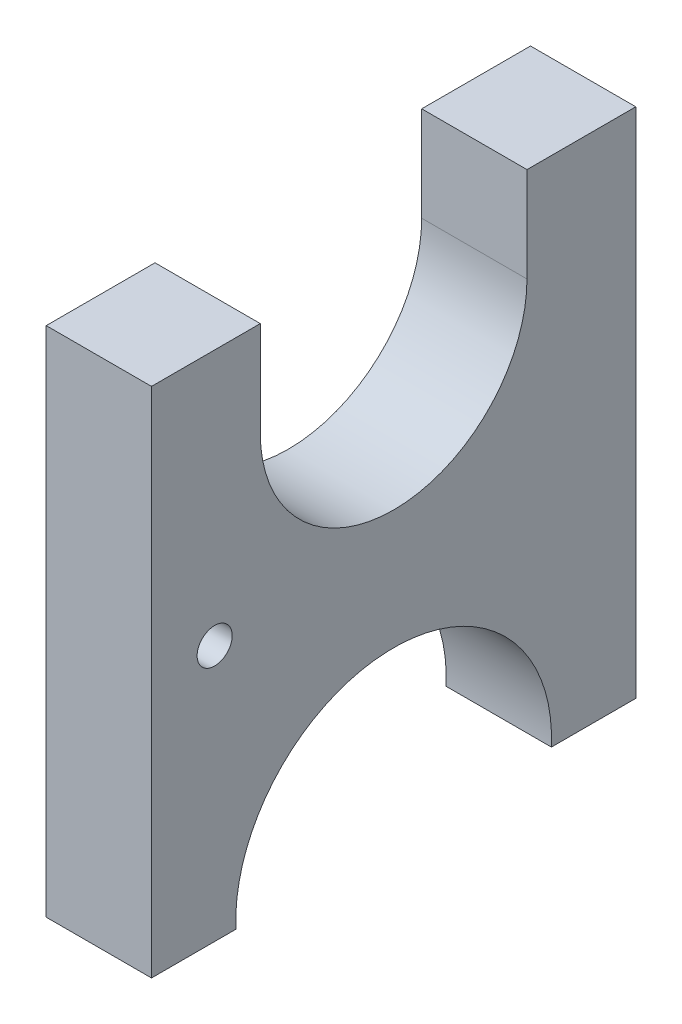
ISO-10303-21;
HEADER;
FILE_DESCRIPTION(('STEP AP214'),'2;1');
FILE_NAME('part.step','',(''),(''),'','','');
FILE_SCHEMA(('AUTOMOTIVE_DESIGN { 1 0 10303 214 1 1 1 1 }'));
ENDSEC;
DATA;
#1=APPLICATION_CONTEXT('core data for automotive mechanical design processes');
#2=APPLICATION_PROTOCOL_DEFINITION('international standard','automotive_design',2000,#1);
#3=PRODUCT_CONTEXT('',#1,'mechanical');
#4=PRODUCT('Part','Part','',(#3));
#5=PRODUCT_RELATED_PRODUCT_CATEGORY('part','',(#4));
#6=PRODUCT_DEFINITION_FORMATION('','',#4);
#7=PRODUCT_DEFINITION_CONTEXT('part definition',#1,'design');
#8=PRODUCT_DEFINITION('design','',#6,#7);
#9=PRODUCT_DEFINITION_SHAPE('','',#8);
#10=(LENGTH_UNIT() NAMED_UNIT(*) SI_UNIT(.MILLI.,.METRE.));
#11=(NAMED_UNIT(*) PLANE_ANGLE_UNIT() SI_UNIT($,.RADIAN.));
#12=(NAMED_UNIT(*) SI_UNIT($,.STERADIAN.) SOLID_ANGLE_UNIT());
#13=UNCERTAINTY_MEASURE_WITH_UNIT(LENGTH_MEASURE(1.E-05),#10,'distance_accuracy_value','');
#14=(GEOMETRIC_REPRESENTATION_CONTEXT(3) GLOBAL_UNCERTAINTY_ASSIGNED_CONTEXT((#13)) GLOBAL_UNIT_ASSIGNED_CONTEXT((#10,
#11,#12)) REPRESENTATION_CONTEXT('',''));
#15=CARTESIAN_POINT('',(0.,0.,0.));
#16=DIRECTION('',(0.,0.,1.));
#17=DIRECTION('',(1.,0.,0.));
#18=AXIS2_PLACEMENT_3D('',#15,#16,#17);
#19=CARTESIAN_POINT('',(-3.,-12.5,19.));
#20=DIRECTION('',(0.,0.,-1.));
#21=DIRECTION('',(0.,1.,0.));
#22=AXIS2_PLACEMENT_3D('',#19,#20,#21);
#23=PLANE('',#22);
#24=DIRECTION('',(0.,1.,0.));
#25=VECTOR('',#24,1.);
#26=CARTESIAN_POINT('',(12.,-12.5,19.));
#27=LINE('',#26,#25);
#28=CARTESIAN_POINT('',(12.,-12.5,19.));
#29=VERTEX_POINT('',#28);
#30=CARTESIAN_POINT('',(12.,1.,19.));
#31=VERTEX_POINT('',#30);
#32=EDGE_CURVE('E158',#29,#31,#27,.T.);
#33=ORIENTED_EDGE('',*,*,#32,.F.);
#34=DIRECTION('',(1.,0.,0.));
#35=VECTOR('',#34,1.);
#36=CARTESIAN_POINT('',(-3.,-12.5,19.));
#37=LINE('',#36,#35);
#38=CARTESIAN_POINT('',(-3.,-12.5,19.));
#39=VERTEX_POINT('',#38);
#40=EDGE_CURVE('E56',#39,#29,#37,.T.);
#41=ORIENTED_EDGE('',*,*,#40,.F.);
#42=DIRECTION('',(0.,1.,0.));
#43=VECTOR('',#42,1.);
#44=CARTESIAN_POINT('',(-3.,-12.5,19.));
#45=LINE('',#44,#43);
#46=CARTESIAN_POINT('',(-3.,1.,19.));
#47=VERTEX_POINT('',#46);
#48=EDGE_CURVE('E186',#39,#47,#45,.T.);
#49=ORIENTED_EDGE('',*,*,#48,.T.);
#50=DIRECTION('',(1.,0.,0.));
#51=VECTOR('',#50,1.);
#52=CARTESIAN_POINT('',(-3.,1.,19.));
#53=LINE('',#52,#51);
#54=EDGE_CURVE('E110',#47,#31,#53,.T.);
#55=ORIENTED_EDGE('',*,*,#54,.T.);
#56=EDGE_LOOP('',(#33,#41,#49,#55));
#57=FACE_BOUND('',#56,.T.);
#58=ADVANCED_FACE('F47',(#57),#23,.T.);
#59=CARTESIAN_POINT('',(-3.,-12.5,0.));
#60=DIRECTION('',(1.,0.,0.));
#61=DIRECTION('',(0.,0.,-1.));
#62=AXIS2_PLACEMENT_3D('',#59,#60,#61);
#63=CYLINDRICAL_SURFACE('',#62,19.);
#64=CARTESIAN_POINT('',(12.,-12.5,0.));
#65=DIRECTION('',(-1.,0.,0.));
#66=DIRECTION('',(0.,0.,-1.));
#67=AXIS2_PLACEMENT_3D('',#64,#65,#66);
#68=CIRCLE('',#67,19.);
#69=CARTESIAN_POINT('',(12.,-12.5,-19.));
#70=VERTEX_POINT('',#69);
#71=EDGE_CURVE('E183',#70,#29,#68,.T.);
#72=ORIENTED_EDGE('',*,*,#71,.F.);
#73=DIRECTION('',(1.,0.,0.));
#74=VECTOR('',#73,1.);
#75=CARTESIAN_POINT('',(-3.,-12.5,-19.));
#76=LINE('',#75,#74);
#77=CARTESIAN_POINT('',(-3.,-12.5,-19.));
#78=VERTEX_POINT('',#77);
#79=EDGE_CURVE('E98',#78,#70,#76,.T.);
#80=ORIENTED_EDGE('',*,*,#79,.F.);
#81=CARTESIAN_POINT('',(-3.,-12.5,0.));
#82=DIRECTION('',(-1.,0.,0.));
#83=DIRECTION('',(0.,0.,-1.));
#84=AXIS2_PLACEMENT_3D('',#81,#82,#83);
#85=CIRCLE('',#84,19.);
#86=EDGE_CURVE('E148',#78,#39,#85,.T.);
#87=ORIENTED_EDGE('',*,*,#86,.T.);
#88=ORIENTED_EDGE('',*,*,#40,.T.);
#89=EDGE_LOOP('',(#72,#80,#87,#88));
#90=FACE_BOUND('',#89,.T.);
#91=ADVANCED_FACE('F202',(#90),#63,.F.);
#92=CARTESIAN_POINT('',(-3.,1.,-19.));
#93=DIRECTION('',(0.,0.,1.));
#94=DIRECTION('',(1.,0.,0.));
#95=AXIS2_PLACEMENT_3D('',#92,#93,#94);
#96=PLANE('',#95);
#97=DIRECTION('',(0.,-1.,0.));
#98=VECTOR('',#97,1.);
#99=CARTESIAN_POINT('',(12.,1.,-19.));
#100=LINE('',#99,#98);
#101=CARTESIAN_POINT('',(12.,1.,-19.));
#102=VERTEX_POINT('',#101);
#103=EDGE_CURVE('E135',#102,#70,#100,.T.);
#104=ORIENTED_EDGE('',*,*,#103,.F.);
#105=DIRECTION('',(1.,0.,0.));
#106=VECTOR('',#105,1.);
#107=CARTESIAN_POINT('',(-3.,1.,-19.));
#108=LINE('',#107,#106);
#109=CARTESIAN_POINT('',(-3.,1.,-19.));
#110=VERTEX_POINT('',#109);
#111=EDGE_CURVE('E130',#110,#102,#108,.T.);
#112=ORIENTED_EDGE('',*,*,#111,.F.);
#113=DIRECTION('',(0.,-1.,0.));
#114=VECTOR('',#113,1.);
#115=CARTESIAN_POINT('',(-3.,1.,-19.));
#116=LINE('',#115,#114);
#117=EDGE_CURVE('E133',#110,#78,#116,.T.);
#118=ORIENTED_EDGE('',*,*,#117,.T.);
#119=ORIENTED_EDGE('',*,*,#79,.T.);
#120=EDGE_LOOP('',(#104,#112,#118,#119));
#121=FACE_BOUND('',#120,.T.);
#122=ADVANCED_FACE('F132',(#121),#96,.T.);
#123=CARTESIAN_POINT('',(-3.,1.,-34.5));
#124=DIRECTION('',(0.,1.,0.));
#125=DIRECTION('',(0.,0.,1.));
#126=AXIS2_PLACEMENT_3D('',#123,#124,#125);
#127=PLANE('',#126);
#128=DIRECTION('',(0.,0.,1.));
#129=VECTOR('',#128,1.);
#130=CARTESIAN_POINT('',(12.,1.,-34.5));
#131=LINE('',#130,#129);
#132=CARTESIAN_POINT('',(12.,1.,-34.5));
#133=VERTEX_POINT('',#132);
#134=EDGE_CURVE('E180',#133,#102,#131,.T.);
#135=ORIENTED_EDGE('',*,*,#134,.F.);
#136=DIRECTION('',(1.,0.,0.));
#137=VECTOR('',#136,1.);
#138=CARTESIAN_POINT('',(-3.,1.,-34.5));
#139=LINE('',#138,#137);
#140=CARTESIAN_POINT('',(-3.,1.,-34.5));
#141=VERTEX_POINT('',#140);
#142=EDGE_CURVE('E140',#141,#133,#139,.T.);
#143=ORIENTED_EDGE('',*,*,#142,.F.);
#144=DIRECTION('',(0.,0.,1.));
#145=VECTOR('',#144,1.);
#146=CARTESIAN_POINT('',(-3.,1.,-34.5));
#147=LINE('',#146,#145);
#148=EDGE_CURVE('E146',#141,#110,#147,.T.);
#149=ORIENTED_EDGE('',*,*,#148,.T.);
#150=ORIENTED_EDGE('',*,*,#111,.T.);
#151=EDGE_LOOP('',(#135,#143,#149,#150));
#152=FACE_BOUND('',#151,.T.);
#153=ADVANCED_FACE('F150',(#152),#127,.T.);
#154=CARTESIAN_POINT('',(-3.,-72.,-34.5));
#155=DIRECTION('',(0.,0.,-1.));
#156=DIRECTION('',(-1.,0.,0.));
#157=AXIS2_PLACEMENT_3D('',#154,#155,#156);
#158=PLANE('',#157);
#159=DIRECTION('',(0.,1.,0.));
#160=VECTOR('',#159,1.);
#161=CARTESIAN_POINT('',(12.,-72.,-34.5));
#162=LINE('',#161,#160);
#163=CARTESIAN_POINT('',(12.,-72.,-34.5));
#164=VERTEX_POINT('',#163);
#165=EDGE_CURVE('E177',#164,#133,#162,.T.);
#166=ORIENTED_EDGE('',*,*,#165,.F.);
#167=DIRECTION('',(1.,0.,0.));
#168=VECTOR('',#167,1.);
#169=CARTESIAN_POINT('',(-3.,-72.,-34.5));
#170=LINE('',#169,#168);
#171=CARTESIAN_POINT('',(-3.,-72.,-34.5));
#172=VERTEX_POINT('',#171);
#173=EDGE_CURVE('E190',#172,#164,#170,.T.);
#174=ORIENTED_EDGE('',*,*,#173,.F.);
#175=DIRECTION('',(0.,1.,0.));
#176=VECTOR('',#175,1.);
#177=CARTESIAN_POINT('',(-3.,-72.,-34.5));
#178=LINE('',#177,#176);
#179=EDGE_CURVE('E151',#172,#141,#178,.T.);
#180=ORIENTED_EDGE('',*,*,#179,.T.);
#181=ORIENTED_EDGE('',*,*,#142,.T.);
#182=EDGE_LOOP('',(#166,#174,#180,#181));
#183=FACE_BOUND('',#182,.T.);
#184=ADVANCED_FACE('F215',(#183),#158,.T.);
#185=CARTESIAN_POINT('',(-3.,-72.,-22.4777667929891));
#186=DIRECTION('',(0.,-1.,0.));
#187=DIRECTION('',(0.,0.,-1.));
#188=AXIS2_PLACEMENT_3D('',#185,#186,#187);
#189=PLANE('',#188);
#190=DIRECTION('',(0.,0.,-1.));
#191=VECTOR('',#190,1.);
#192=CARTESIAN_POINT('',(12.,-72.,-22.4777667929891));
#193=LINE('',#192,#191);
#194=CARTESIAN_POINT('',(12.,-72.,-22.4777667929891));
#195=VERTEX_POINT('',#194);
#196=EDGE_CURVE('E174',#195,#164,#193,.T.);
#197=ORIENTED_EDGE('',*,*,#196,.F.);
#198=DIRECTION('',(1.,0.,0.));
#199=VECTOR('',#198,1.);
#200=CARTESIAN_POINT('',(-3.,-72.,-22.4777667929891));
#201=LINE('',#200,#199);
#202=CARTESIAN_POINT('',(-3.,-72.,-22.4777667929891));
#203=VERTEX_POINT('',#202);
#204=EDGE_CURVE('E192',#203,#195,#201,.T.);
#205=ORIENTED_EDGE('',*,*,#204,.F.);
#206=DIRECTION('',(0.,0.,-1.));
#207=VECTOR('',#206,1.);
#208=CARTESIAN_POINT('',(-3.,-72.,-22.4777667929891));
#209=LINE('',#208,#207);
#210=EDGE_CURVE('E153',#203,#172,#209,.T.);
#211=ORIENTED_EDGE('',*,*,#210,.T.);
#212=ORIENTED_EDGE('',*,*,#173,.T.);
#213=EDGE_LOOP('',(#197,#205,#211,#212));
#214=FACE_BOUND('',#213,.T.);
#215=ADVANCED_FACE('F218',(#214),#189,.T.);
#216=CARTESIAN_POINT('',(-3.,-71.,0.));
#217=DIRECTION('',(1.,0.,0.));
#218=DIRECTION('',(0.,0.,-1.));
#219=AXIS2_PLACEMENT_3D('',#216,#217,#218);
#220=CYLINDRICAL_SURFACE('',#219,22.5);
#221=CARTESIAN_POINT('',(12.,-71.,0.));
#222=DIRECTION('',(-1.,0.,0.));
#223=DIRECTION('',(0.,0.,-1.));
#224=AXIS2_PLACEMENT_3D('',#221,#222,#223);
#225=CIRCLE('',#224,22.5);
#226=CARTESIAN_POINT('',(12.,-72.,22.4777667929889));
#227=VERTEX_POINT('',#226);
#228=EDGE_CURVE('E171',#227,#195,#225,.T.);
#229=ORIENTED_EDGE('',*,*,#228,.F.);
#230=DIRECTION('',(1.,0.,0.));
#231=VECTOR('',#230,1.);
#232=CARTESIAN_POINT('',(-3.,-72.,22.4777667929889));
#233=LINE('',#232,#231);
#234=CARTESIAN_POINT('',(-3.,-72.,22.4777667929889));
#235=VERTEX_POINT('',#234);
#236=EDGE_CURVE('E194',#235,#227,#233,.T.);
#237=ORIENTED_EDGE('',*,*,#236,.F.);
#238=CARTESIAN_POINT('',(-3.,-71.,0.));
#239=DIRECTION('',(-1.,0.,0.));
#240=DIRECTION('',(0.,0.,-1.));
#241=AXIS2_PLACEMENT_3D('',#238,#239,#240);
#242=CIRCLE('',#241,22.5);
#243=EDGE_CURVE('E259',#235,#203,#242,.T.);
#244=ORIENTED_EDGE('',*,*,#243,.T.);
#245=ORIENTED_EDGE('',*,*,#204,.T.);
#246=EDGE_LOOP('',(#229,#237,#244,#245));
#247=FACE_BOUND('',#246,.T.);
#248=ADVANCED_FACE('F222',(#247),#220,.F.);
#249=CARTESIAN_POINT('',(-3.,-72.,34.5));
#250=DIRECTION('',(0.,-1.,0.));
#251=DIRECTION('',(0.,0.,-1.));
#252=AXIS2_PLACEMENT_3D('',#249,#250,#251);
#253=PLANE('',#252);
#254=DIRECTION('',(0.,0.,-1.));
#255=VECTOR('',#254,1.);
#256=CARTESIAN_POINT('',(12.,-72.,34.5));
#257=LINE('',#256,#255);
#258=CARTESIAN_POINT('',(12.,-72.,34.5));
#259=VERTEX_POINT('',#258);
#260=EDGE_CURVE('E168',#259,#227,#257,.T.);
#261=ORIENTED_EDGE('',*,*,#260,.F.);
#262=DIRECTION('',(1.,0.,0.));
#263=VECTOR('',#262,1.);
#264=CARTESIAN_POINT('',(-3.,-72.,34.5));
#265=LINE('',#264,#263);
#266=CARTESIAN_POINT('',(-3.,-72.,34.5));
#267=VERTEX_POINT('',#266);
#268=EDGE_CURVE('E196',#267,#259,#265,.T.);
#269=ORIENTED_EDGE('',*,*,#268,.F.);
#270=DIRECTION('',(0.,0.,-1.));
#271=VECTOR('',#270,1.);
#272=CARTESIAN_POINT('',(-3.,-72.,34.5));
#273=LINE('',#272,#271);
#274=EDGE_CURVE('E256',#267,#235,#273,.T.);
#275=ORIENTED_EDGE('',*,*,#274,.T.);
#276=ORIENTED_EDGE('',*,*,#236,.T.);
#277=EDGE_LOOP('',(#261,#269,#275,#276));
#278=FACE_BOUND('',#277,.T.);
#279=ADVANCED_FACE('F226',(#278),#253,.T.);
#280=CARTESIAN_POINT('',(-3.,1.,34.5));
#281=DIRECTION('',(0.,0.,1.));
#282=DIRECTION('',(1.,0.,0.));
#283=AXIS2_PLACEMENT_3D('',#280,#281,#282);
#284=PLANE('',#283);
#285=DIRECTION('',(0.,-1.,0.));
#286=VECTOR('',#285,1.);
#287=CARTESIAN_POINT('',(12.,1.,34.5));
#288=LINE('',#287,#286);
#289=CARTESIAN_POINT('',(12.,1.,34.5));
#290=VERTEX_POINT('',#289);
#291=EDGE_CURVE('E165',#290,#259,#288,.T.);
#292=ORIENTED_EDGE('',*,*,#291,.F.);
#293=DIRECTION('',(1.,0.,0.));
#294=VECTOR('',#293,1.);
#295=CARTESIAN_POINT('',(-3.,1.,34.5));
#296=LINE('',#295,#294);
#297=CARTESIAN_POINT('',(-3.,1.,34.5));
#298=VERTEX_POINT('',#297);
#299=EDGE_CURVE('E198',#298,#290,#296,.T.);
#300=ORIENTED_EDGE('',*,*,#299,.F.);
#301=DIRECTION('',(0.,-1.,0.));
#302=VECTOR('',#301,1.);
#303=CARTESIAN_POINT('',(-3.,1.,34.5));
#304=LINE('',#303,#302);
#305=EDGE_CURVE('E253',#298,#267,#304,.T.);
#306=ORIENTED_EDGE('',*,*,#305,.T.);
#307=ORIENTED_EDGE('',*,*,#268,.T.);
#308=EDGE_LOOP('',(#292,#300,#306,#307));
#309=FACE_BOUND('',#308,.T.);
#310=ADVANCED_FACE('F230',(#309),#284,.T.);
#311=CARTESIAN_POINT('',(-3.,1.,19.));
#312=DIRECTION('',(0.,1.,0.));
#313=DIRECTION('',(0.,0.,1.));
#314=AXIS2_PLACEMENT_3D('',#311,#312,#313);
#315=PLANE('',#314);
#316=DIRECTION('',(0.,0.,1.));
#317=VECTOR('',#316,1.);
#318=CARTESIAN_POINT('',(12.,1.,19.));
#319=LINE('',#318,#317);
#320=EDGE_CURVE('E161',#31,#290,#319,.T.);
#321=ORIENTED_EDGE('',*,*,#320,.F.);
#322=ORIENTED_EDGE('',*,*,#54,.F.);
#323=DIRECTION('',(0.,0.,1.));
#324=VECTOR('',#323,1.);
#325=CARTESIAN_POINT('',(-3.,1.,19.));
#326=LINE('',#325,#324);
#327=EDGE_CURVE('E251',#47,#298,#326,.T.);
#328=ORIENTED_EDGE('',*,*,#327,.T.);
#329=ORIENTED_EDGE('',*,*,#299,.T.);
#330=EDGE_LOOP('',(#321,#322,#328,#329));
#331=FACE_BOUND('',#330,.T.);
#332=ADVANCED_FACE('F199',(#331),#315,.T.);
#333=CARTESIAN_POINT('',(-3.,-71.,0.));
#334=DIRECTION('',(1.,0.,0.));
#335=DIRECTION('',(0.,0.,-1.));
#336=AXIS2_PLACEMENT_3D('',#333,#334,#335);
#337=PLANE('',#336);
#338=CARTESIAN_POINT('',(-3.,-35.5,25.5));
#339=DIRECTION('',(1.,0.,0.));
#340=DIRECTION('',(0.,0.,-1.));
#341=AXIS2_PLACEMENT_3D('',#338,#339,#340);
#342=CIRCLE('',#341,2.5);
#343=CARTESIAN_POINT('',(-3.,-35.5,23.));
#344=VERTEX_POINT('',#343);
#345=EDGE_CURVE('E162',#344,#344,#342,.T.);
#346=ORIENTED_EDGE('',*,*,#345,.T.);
#347=EDGE_LOOP('',(#346));
#348=FACE_BOUND('',#347,.T.);
#349=ORIENTED_EDGE('',*,*,#48,.F.);
#350=ORIENTED_EDGE('',*,*,#86,.F.);
#351=ORIENTED_EDGE('',*,*,#117,.F.);
#352=ORIENTED_EDGE('',*,*,#148,.F.);
#353=ORIENTED_EDGE('',*,*,#179,.F.);
#354=ORIENTED_EDGE('',*,*,#210,.F.);
#355=ORIENTED_EDGE('',*,*,#243,.F.);
#356=ORIENTED_EDGE('',*,*,#274,.F.);
#357=ORIENTED_EDGE('',*,*,#305,.F.);
#358=ORIENTED_EDGE('',*,*,#327,.F.);
#359=EDGE_LOOP('',(#349,#350,#351,#352,#353,#354,#355,#356,#357,#358));
#360=FACE_BOUND('',#359,.T.);
#361=ADVANCED_FACE('F144',(#348,#360),#337,.F.);
#362=CARTESIAN_POINT('',(12.,-71.,0.));
#363=DIRECTION('',(1.,0.,0.));
#364=DIRECTION('',(0.,0.,-1.));
#365=AXIS2_PLACEMENT_3D('',#362,#363,#364);
#366=PLANE('',#365);
#367=CARTESIAN_POINT('',(12.,-35.5,25.5));
#368=DIRECTION('',(1.,0.,0.));
#369=DIRECTION('',(0.,0.,-1.));
#370=AXIS2_PLACEMENT_3D('',#367,#368,#369);
#371=CIRCLE('',#370,2.5);
#372=CARTESIAN_POINT('',(12.,-35.5,23.));
#373=VERTEX_POINT('',#372);
#374=EDGE_CURVE('E13',#373,#373,#371,.T.);
#375=ORIENTED_EDGE('',*,*,#374,.F.);
#376=EDGE_LOOP('',(#375));
#377=FACE_BOUND('',#376,.T.);
#378=ORIENTED_EDGE('',*,*,#32,.T.);
#379=ORIENTED_EDGE('',*,*,#320,.T.);
#380=ORIENTED_EDGE('',*,*,#291,.T.);
#381=ORIENTED_EDGE('',*,*,#260,.T.);
#382=ORIENTED_EDGE('',*,*,#228,.T.);
#383=ORIENTED_EDGE('',*,*,#196,.T.);
#384=ORIENTED_EDGE('',*,*,#165,.T.);
#385=ORIENTED_EDGE('',*,*,#134,.T.);
#386=ORIENTED_EDGE('',*,*,#103,.T.);
#387=ORIENTED_EDGE('',*,*,#71,.T.);
#388=EDGE_LOOP('',(#378,#379,#380,#381,#382,#383,#384,#385,#386,#387));
#389=FACE_BOUND('',#388,.T.);
#390=ADVANCED_FACE('F49',(#377,#389),#366,.T.);
#391=CARTESIAN_POINT('',(0.,-35.5,25.5));
#392=DIRECTION('',(1.,0.,0.));
#393=DIRECTION('',(0.,0.,-1.));
#394=AXIS2_PLACEMENT_3D('',#391,#392,#393);
#395=CYLINDRICAL_SURFACE('',#394,2.5);
#396=ORIENTED_EDGE('',*,*,#374,.T.);
#397=EDGE_LOOP('',(#396));
#398=FACE_BOUND('',#397,.T.);
#399=ORIENTED_EDGE('',*,*,#345,.F.);
#400=EDGE_LOOP('',(#399));
#401=FACE_BOUND('',#400,.T.);
#402=ADVANCED_FACE('F236',(#398,#401),#395,.F.);
#403=CLOSED_SHELL('',(#58,#91,#122,#153,#184,#215,#248,#279,#310,#332,#361,#390,#402));
#404=MANIFOLD_SOLID_BREP('B2',#403);
#405=ADVANCED_BREP_SHAPE_REPRESENTATION('',(#18,#404),#14);
#406=SHAPE_DEFINITION_REPRESENTATION(#9,#405);
ENDSEC;
END-ISO-10303-21;
